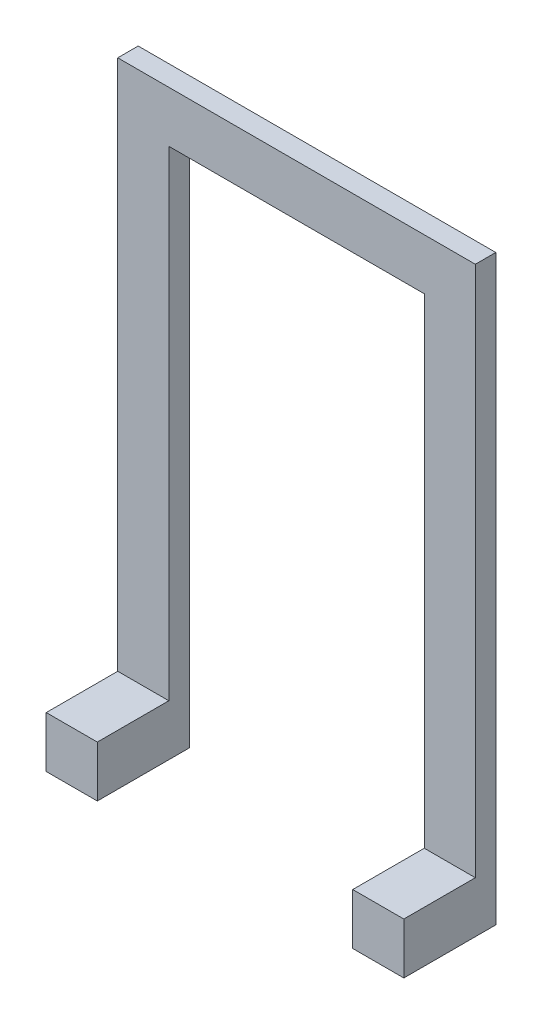
ISO-10303-21;
HEADER;
FILE_DESCRIPTION(('STEP AP214'),'2;1');
FILE_NAME('part.step','',(''),(''),'','','');
FILE_SCHEMA(('AUTOMOTIVE_DESIGN { 1 0 10303 214 1 1 1 1 }'));
ENDSEC;
DATA;
#1=APPLICATION_CONTEXT('core data for automotive mechanical design processes');
#2=APPLICATION_PROTOCOL_DEFINITION('international standard','automotive_design',2000,#1);
#3=PRODUCT_CONTEXT('',#1,'mechanical');
#4=PRODUCT('Part','Part','',(#3));
#5=PRODUCT_RELATED_PRODUCT_CATEGORY('part','',(#4));
#6=PRODUCT_DEFINITION_FORMATION('','',#4);
#7=PRODUCT_DEFINITION_CONTEXT('part definition',#1,'design');
#8=PRODUCT_DEFINITION('design','',#6,#7);
#9=PRODUCT_DEFINITION_SHAPE('','',#8);
#10=(LENGTH_UNIT() NAMED_UNIT(*) SI_UNIT(.MILLI.,.METRE.));
#11=(NAMED_UNIT(*) PLANE_ANGLE_UNIT() SI_UNIT($,.RADIAN.));
#12=(NAMED_UNIT(*) SI_UNIT($,.STERADIAN.) SOLID_ANGLE_UNIT());
#13=UNCERTAINTY_MEASURE_WITH_UNIT(LENGTH_MEASURE(1.E-05),#10,'distance_accuracy_value','');
#14=(GEOMETRIC_REPRESENTATION_CONTEXT(3) GLOBAL_UNCERTAINTY_ASSIGNED_CONTEXT((#13)) GLOBAL_UNIT_ASSIGNED_CONTEXT((#10,
#11,#12)) REPRESENTATION_CONTEXT('',''));
#15=CARTESIAN_POINT('',(0.,0.,0.));
#16=DIRECTION('',(0.,0.,1.));
#17=DIRECTION('',(1.,0.,0.));
#18=AXIS2_PLACEMENT_3D('',#15,#16,#17);
#19=CARTESIAN_POINT('',(0.,0.,1.));
#20=DIRECTION('',(0.,0.,1.));
#21=DIRECTION('',(1.,0.,0.));
#22=AXIS2_PLACEMENT_3D('',#19,#20,#21);
#23=PLANE('',#22);
#24=DIRECTION('',(0.,1.,0.));
#25=VECTOR('',#24,1.);
#26=CARTESIAN_POINT('',(6.25,0.,1.));
#27=LINE('',#26,#25);
#28=CARTESIAN_POINT('',(6.25,-14.75,1.));
#29=VERTEX_POINT('',#28);
#30=CARTESIAN_POINT('',(6.25,8.75,1.));
#31=VERTEX_POINT('',#30);
#32=EDGE_CURVE('E209',#29,#31,#27,.T.);
#33=ORIENTED_EDGE('',*,*,#32,.F.);
#34=DIRECTION('',(-1.,0.,0.));
#35=VECTOR('',#34,1.);
#36=CARTESIAN_POINT('',(6.25,-14.75,1.));
#37=LINE('',#36,#35);
#38=CARTESIAN_POINT('',(8.74999999999998,-14.75,1.));
#39=VERTEX_POINT('',#38);
#40=EDGE_CURVE('E161',#39,#29,#37,.T.);
#41=ORIENTED_EDGE('',*,*,#40,.F.);
#42=DIRECTION('',(0.,1.,0.));
#43=VECTOR('',#42,1.);
#44=CARTESIAN_POINT('',(8.74999999999999,0.,1.));
#45=LINE('',#44,#43);
#46=CARTESIAN_POINT('',(8.75,11.25,1.));
#47=VERTEX_POINT('',#46);
#48=EDGE_CURVE('E212',#39,#47,#45,.T.);
#49=ORIENTED_EDGE('',*,*,#48,.T.);
#50=DIRECTION('',(1.,0.,0.));
#51=VECTOR('',#50,1.);
#52=CARTESIAN_POINT('',(0.,11.25,1.));
#53=LINE('',#52,#51);
#54=CARTESIAN_POINT('',(-8.75,11.25,1.));
#55=VERTEX_POINT('',#54);
#56=EDGE_CURVE('E215',#55,#47,#53,.T.);
#57=ORIENTED_EDGE('',*,*,#56,.F.);
#58=DIRECTION('',(0.,1.,0.));
#59=VECTOR('',#58,1.);
#60=CARTESIAN_POINT('',(-8.75,0.,1.));
#61=LINE('',#60,#59);
#62=CARTESIAN_POINT('',(-8.75,-14.75,1.));
#63=VERTEX_POINT('',#62);
#64=EDGE_CURVE('E219',#63,#55,#61,.T.);
#65=ORIENTED_EDGE('',*,*,#64,.F.);
#66=DIRECTION('',(-1.,0.,0.));
#67=VECTOR('',#66,1.);
#68=CARTESIAN_POINT('',(-6.25,-14.75,1.));
#69=LINE('',#68,#67);
#70=CARTESIAN_POINT('',(-6.25,-14.75,1.));
#71=VERTEX_POINT('',#70);
#72=EDGE_CURVE('E67',#71,#63,#69,.T.);
#73=ORIENTED_EDGE('',*,*,#72,.F.);
#74=DIRECTION('',(0.,1.,0.));
#75=VECTOR('',#74,1.);
#76=CARTESIAN_POINT('',(-6.25,0.,1.));
#77=LINE('',#76,#75);
#78=CARTESIAN_POINT('',(-6.25,8.75,1.));
#79=VERTEX_POINT('',#78);
#80=EDGE_CURVE('E201',#71,#79,#77,.T.);
#81=ORIENTED_EDGE('',*,*,#80,.T.);
#82=DIRECTION('',(1.,0.,0.));
#83=VECTOR('',#82,1.);
#84=CARTESIAN_POINT('',(0.,8.75,1.));
#85=LINE('',#84,#83);
#86=EDGE_CURVE('E204',#79,#31,#85,.T.);
#87=ORIENTED_EDGE('',*,*,#86,.T.);
#88=EDGE_LOOP('',(#33,#41,#49,#57,#65,#73,#81,#87));
#89=FACE_BOUND('',#88,.T.);
#90=ADVANCED_FACE('F43',(#89),#23,.T.);
#91=CARTESIAN_POINT('',(0.,-17.25,1.));
#92=DIRECTION('',(0.,1.,0.));
#93=DIRECTION('',(0.,0.,1.));
#94=AXIS2_PLACEMENT_3D('',#91,#92,#93);
#95=PLANE('',#94);
#96=DIRECTION('',(1.,0.,0.));
#97=VECTOR('',#96,1.);
#98=CARTESIAN_POINT('',(0.,-17.25,0.));
#99=LINE('',#98,#97);
#100=CARTESIAN_POINT('',(-8.75,-17.25,0.));
#101=VERTEX_POINT('',#100);
#102=CARTESIAN_POINT('',(-6.25,-17.25,0.));
#103=VERTEX_POINT('',#102);
#104=EDGE_CURVE('E200',#101,#103,#99,.T.);
#105=ORIENTED_EDGE('',*,*,#104,.T.);
#106=DIRECTION('',(0.,0.,-1.));
#107=VECTOR('',#106,1.);
#108=CARTESIAN_POINT('',(-6.25,-17.25,1.));
#109=LINE('',#108,#107);
#110=CARTESIAN_POINT('',(-6.25,-17.25,4.5));
#111=VERTEX_POINT('',#110);
#112=EDGE_CURVE('E11',#111,#103,#109,.T.);
#113=ORIENTED_EDGE('',*,*,#112,.F.);
#114=DIRECTION('',(1.,0.,0.));
#115=VECTOR('',#114,1.);
#116=CARTESIAN_POINT('',(-6.25,-17.25,4.5));
#117=LINE('',#116,#115);
#118=CARTESIAN_POINT('',(-8.75,-17.25,4.5));
#119=VERTEX_POINT('',#118);
#120=EDGE_CURVE('E186',#119,#111,#117,.T.);
#121=ORIENTED_EDGE('',*,*,#120,.F.);
#122=DIRECTION('',(0.,0.,-1.));
#123=VECTOR('',#122,1.);
#124=CARTESIAN_POINT('',(-8.75,-17.25,1.));
#125=LINE('',#124,#123);
#126=EDGE_CURVE('E222',#119,#101,#125,.T.);
#127=ORIENTED_EDGE('',*,*,#126,.T.);
#128=EDGE_LOOP('',(#105,#113,#121,#127));
#129=FACE_BOUND('',#128,.T.);
#130=ADVANCED_FACE('F45',(#129),#95,.F.);
#131=CARTESIAN_POINT('',(-6.25,0.,1.));
#132=DIRECTION('',(-1.,0.,0.));
#133=DIRECTION('',(0.,0.,1.));
#134=AXIS2_PLACEMENT_3D('',#131,#132,#133);
#135=PLANE('',#134);
#136=DIRECTION('',(0.,1.,0.));
#137=VECTOR('',#136,1.);
#138=CARTESIAN_POINT('',(-6.25,0.,0.));
#139=LINE('',#138,#137);
#140=CARTESIAN_POINT('',(-6.25,8.75,0.));
#141=VERTEX_POINT('',#140);
#142=EDGE_CURVE('E226',#103,#141,#139,.T.);
#143=ORIENTED_EDGE('',*,*,#142,.T.);
#144=DIRECTION('',(0.,0.,-1.));
#145=VECTOR('',#144,1.);
#146=CARTESIAN_POINT('',(-6.25,8.75,1.));
#147=LINE('',#146,#145);
#148=EDGE_CURVE('E52',#79,#141,#147,.T.);
#149=ORIENTED_EDGE('',*,*,#148,.F.);
#150=ORIENTED_EDGE('',*,*,#80,.F.);
#151=DIRECTION('',(0.,0.,-1.));
#152=VECTOR('',#151,1.);
#153=CARTESIAN_POINT('',(-6.25,-14.75,4.5));
#154=LINE('',#153,#152);
#155=CARTESIAN_POINT('',(-6.25,-14.75,4.5));
#156=VERTEX_POINT('',#155);
#157=EDGE_CURVE('E196',#156,#71,#154,.T.);
#158=ORIENTED_EDGE('',*,*,#157,.F.);
#159=DIRECTION('',(0.,1.,0.));
#160=VECTOR('',#159,1.);
#161=CARTESIAN_POINT('',(-6.25,-17.25,4.5));
#162=LINE('',#161,#160);
#163=EDGE_CURVE('E175',#111,#156,#162,.T.);
#164=ORIENTED_EDGE('',*,*,#163,.F.);
#165=ORIENTED_EDGE('',*,*,#112,.T.);
#166=EDGE_LOOP('',(#143,#149,#150,#158,#164,#165));
#167=FACE_BOUND('',#166,.T.);
#168=ADVANCED_FACE('F280',(#167),#135,.F.);
#169=CARTESIAN_POINT('',(0.,8.75,1.));
#170=DIRECTION('',(0.,1.,0.));
#171=DIRECTION('',(0.,0.,1.));
#172=AXIS2_PLACEMENT_3D('',#169,#170,#171);
#173=PLANE('',#172);
#174=DIRECTION('',(1.,0.,0.));
#175=VECTOR('',#174,1.);
#176=CARTESIAN_POINT('',(0.,8.75,0.));
#177=LINE('',#176,#175);
#178=CARTESIAN_POINT('',(6.25,8.75,0.));
#179=VERTEX_POINT('',#178);
#180=EDGE_CURVE('E229',#141,#179,#177,.T.);
#181=ORIENTED_EDGE('',*,*,#180,.T.);
#182=DIRECTION('',(0.,0.,-1.));
#183=VECTOR('',#182,1.);
#184=CARTESIAN_POINT('',(6.25,8.75,1.));
#185=LINE('',#184,#183);
#186=EDGE_CURVE('E145',#31,#179,#185,.T.);
#187=ORIENTED_EDGE('',*,*,#186,.F.);
#188=ORIENTED_EDGE('',*,*,#86,.F.);
#189=ORIENTED_EDGE('',*,*,#148,.T.);
#190=EDGE_LOOP('',(#181,#187,#188,#189));
#191=FACE_BOUND('',#190,.T.);
#192=ADVANCED_FACE('F266',(#191),#173,.F.);
#193=CARTESIAN_POINT('',(6.25,0.,1.));
#194=DIRECTION('',(-1.,0.,0.));
#195=DIRECTION('',(0.,-1.,0.));
#196=AXIS2_PLACEMENT_3D('',#193,#194,#195);
#197=PLANE('',#196);
#198=DIRECTION('',(0.,1.,0.));
#199=VECTOR('',#198,1.);
#200=CARTESIAN_POINT('',(6.25,0.,0.));
#201=LINE('',#200,#199);
#202=CARTESIAN_POINT('',(6.25,-17.25,0.));
#203=VERTEX_POINT('',#202);
#204=EDGE_CURVE('E141',#203,#179,#201,.T.);
#205=ORIENTED_EDGE('',*,*,#204,.F.);
#206=DIRECTION('',(0.,0.,-1.));
#207=VECTOR('',#206,1.);
#208=CARTESIAN_POINT('',(6.25,-17.25,1.));
#209=LINE('',#208,#207);
#210=CARTESIAN_POINT('',(6.25,-17.25,4.5));
#211=VERTEX_POINT('',#210);
#212=EDGE_CURVE('E134',#211,#203,#209,.T.);
#213=ORIENTED_EDGE('',*,*,#212,.F.);
#214=DIRECTION('',(0.,-1.,0.));
#215=VECTOR('',#214,1.);
#216=CARTESIAN_POINT('',(6.25,-17.25,4.5));
#217=LINE('',#216,#215);
#218=CARTESIAN_POINT('',(6.25,-14.75,4.5));
#219=VERTEX_POINT('',#218);
#220=EDGE_CURVE('E139',#219,#211,#217,.T.);
#221=ORIENTED_EDGE('',*,*,#220,.F.);
#222=DIRECTION('',(0.,0.,-1.));
#223=VECTOR('',#222,1.);
#224=CARTESIAN_POINT('',(6.25,-14.75,4.5));
#225=LINE('',#224,#223);
#226=EDGE_CURVE('E169',#219,#29,#225,.T.);
#227=ORIENTED_EDGE('',*,*,#226,.T.);
#228=ORIENTED_EDGE('',*,*,#32,.T.);
#229=ORIENTED_EDGE('',*,*,#186,.T.);
#230=EDGE_LOOP('',(#205,#213,#221,#227,#228,#229));
#231=FACE_BOUND('',#230,.T.);
#232=ADVANCED_FACE('F136',(#231),#197,.T.);
#233=CARTESIAN_POINT('',(0.,-17.25,1.));
#234=DIRECTION('',(0.,1.,0.));
#235=DIRECTION('',(0.,0.,1.));
#236=AXIS2_PLACEMENT_3D('',#233,#234,#235);
#237=PLANE('',#236);
#238=DIRECTION('',(1.,0.,0.));
#239=VECTOR('',#238,1.);
#240=CARTESIAN_POINT('',(0.,-17.25,0.));
#241=LINE('',#240,#239);
#242=CARTESIAN_POINT('',(8.75,-17.25,0.));
#243=VERTEX_POINT('',#242);
#244=EDGE_CURVE('E235',#203,#243,#241,.T.);
#245=ORIENTED_EDGE('',*,*,#244,.T.);
#246=DIRECTION('',(0.,0.,-1.));
#247=VECTOR('',#246,1.);
#248=CARTESIAN_POINT('',(8.75,-17.25,1.));
#249=LINE('',#248,#247);
#250=CARTESIAN_POINT('',(8.75,-17.25,4.5));
#251=VERTEX_POINT('',#250);
#252=EDGE_CURVE('E146',#251,#243,#249,.T.);
#253=ORIENTED_EDGE('',*,*,#252,.F.);
#254=DIRECTION('',(1.,0.,0.));
#255=VECTOR('',#254,1.);
#256=CARTESIAN_POINT('',(6.25,-17.25,4.5));
#257=LINE('',#256,#255);
#258=EDGE_CURVE('E149',#211,#251,#257,.T.);
#259=ORIENTED_EDGE('',*,*,#258,.F.);
#260=ORIENTED_EDGE('',*,*,#212,.T.);
#261=EDGE_LOOP('',(#245,#253,#259,#260));
#262=FACE_BOUND('',#261,.T.);
#263=ADVANCED_FACE('F150',(#262),#237,.F.);
#264=CARTESIAN_POINT('',(8.74999999999999,0.,1.));
#265=DIRECTION('',(-1.,0.,0.));
#266=DIRECTION('',(0.,-1.,0.));
#267=AXIS2_PLACEMENT_3D('',#264,#265,#266);
#268=PLANE('',#267);
#269=DIRECTION('',(0.,1.,0.));
#270=VECTOR('',#269,1.);
#271=CARTESIAN_POINT('',(8.74999999999999,0.,0.));
#272=LINE('',#271,#270);
#273=CARTESIAN_POINT('',(8.75,11.25,0.));
#274=VERTEX_POINT('',#273);
#275=EDGE_CURVE('E238',#243,#274,#272,.T.);
#276=ORIENTED_EDGE('',*,*,#275,.T.);
#277=DIRECTION('',(0.,0.,-1.));
#278=VECTOR('',#277,1.);
#279=CARTESIAN_POINT('',(8.75,11.25,1.));
#280=LINE('',#279,#278);
#281=EDGE_CURVE('E254',#47,#274,#280,.T.);
#282=ORIENTED_EDGE('',*,*,#281,.F.);
#283=ORIENTED_EDGE('',*,*,#48,.F.);
#284=DIRECTION('',(0.,0.,-1.));
#285=VECTOR('',#284,1.);
#286=CARTESIAN_POINT('',(8.75,-14.75,4.5));
#287=LINE('',#286,#285);
#288=CARTESIAN_POINT('',(8.75,-14.75,4.5));
#289=VERTEX_POINT('',#288);
#290=EDGE_CURVE('E59',#289,#39,#287,.T.);
#291=ORIENTED_EDGE('',*,*,#290,.F.);
#292=DIRECTION('',(0.,1.,0.));
#293=VECTOR('',#292,1.);
#294=CARTESIAN_POINT('',(8.75,-17.25,4.5));
#295=LINE('',#294,#293);
#296=EDGE_CURVE('E155',#251,#289,#295,.T.);
#297=ORIENTED_EDGE('',*,*,#296,.F.);
#298=ORIENTED_EDGE('',*,*,#252,.T.);
#299=EDGE_LOOP('',(#276,#282,#283,#291,#297,#298));
#300=FACE_BOUND('',#299,.T.);
#301=ADVANCED_FACE('F274',(#300),#268,.F.);
#302=CARTESIAN_POINT('',(0.,11.25,1.));
#303=DIRECTION('',(0.,1.,0.));
#304=DIRECTION('',(0.,0.,1.));
#305=AXIS2_PLACEMENT_3D('',#302,#303,#304);
#306=PLANE('',#305);
#307=DIRECTION('',(1.,0.,0.));
#308=VECTOR('',#307,1.);
#309=CARTESIAN_POINT('',(0.,11.25,0.));
#310=LINE('',#309,#308);
#311=CARTESIAN_POINT('',(-8.75,11.25,0.));
#312=VERTEX_POINT('',#311);
#313=EDGE_CURVE('E242',#312,#274,#310,.T.);
#314=ORIENTED_EDGE('',*,*,#313,.F.);
#315=DIRECTION('',(0.,0.,-1.));
#316=VECTOR('',#315,1.);
#317=CARTESIAN_POINT('',(-8.75,11.25,1.));
#318=LINE('',#317,#316);
#319=EDGE_CURVE('E251',#55,#312,#318,.T.);
#320=ORIENTED_EDGE('',*,*,#319,.F.);
#321=ORIENTED_EDGE('',*,*,#56,.T.);
#322=ORIENTED_EDGE('',*,*,#281,.T.);
#323=EDGE_LOOP('',(#314,#320,#321,#322));
#324=FACE_BOUND('',#323,.T.);
#325=ADVANCED_FACE('F297',(#324),#306,.T.);
#326=CARTESIAN_POINT('',(-8.75,0.,1.));
#327=DIRECTION('',(-1.,0.,0.));
#328=DIRECTION('',(0.,-1.,0.));
#329=AXIS2_PLACEMENT_3D('',#326,#327,#328);
#330=PLANE('',#329);
#331=DIRECTION('',(0.,1.,0.));
#332=VECTOR('',#331,1.);
#333=CARTESIAN_POINT('',(-8.75,0.,0.));
#334=LINE('',#333,#332);
#335=EDGE_CURVE('E205',#101,#312,#334,.T.);
#336=ORIENTED_EDGE('',*,*,#335,.F.);
#337=ORIENTED_EDGE('',*,*,#126,.F.);
#338=DIRECTION('',(0.,-1.,0.));
#339=VECTOR('',#338,1.);
#340=CARTESIAN_POINT('',(-8.75,-17.25,4.5));
#341=LINE('',#340,#339);
#342=CARTESIAN_POINT('',(-8.75,-14.75,4.5));
#343=VERTEX_POINT('',#342);
#344=EDGE_CURVE('E182',#343,#119,#341,.T.);
#345=ORIENTED_EDGE('',*,*,#344,.F.);
#346=DIRECTION('',(0.,0.,-1.));
#347=VECTOR('',#346,1.);
#348=CARTESIAN_POINT('',(-8.75,-14.75,4.5));
#349=LINE('',#348,#347);
#350=EDGE_CURVE('E190',#343,#63,#349,.T.);
#351=ORIENTED_EDGE('',*,*,#350,.T.);
#352=ORIENTED_EDGE('',*,*,#64,.T.);
#353=ORIENTED_EDGE('',*,*,#319,.T.);
#354=EDGE_LOOP('',(#336,#337,#345,#351,#352,#353));
#355=FACE_BOUND('',#354,.T.);
#356=ADVANCED_FACE('F292',(#355),#330,.T.);
#357=CARTESIAN_POINT('',(0.,0.,0.));
#358=DIRECTION('',(0.,0.,1.));
#359=DIRECTION('',(1.,0.,0.));
#360=AXIS2_PLACEMENT_3D('',#357,#358,#359);
#361=PLANE('',#360);
#362=ORIENTED_EDGE('',*,*,#104,.F.);
#363=ORIENTED_EDGE('',*,*,#335,.T.);
#364=ORIENTED_EDGE('',*,*,#313,.T.);
#365=ORIENTED_EDGE('',*,*,#275,.F.);
#366=ORIENTED_EDGE('',*,*,#244,.F.);
#367=ORIENTED_EDGE('',*,*,#204,.T.);
#368=ORIENTED_EDGE('',*,*,#180,.F.);
#369=ORIENTED_EDGE('',*,*,#142,.F.);
#370=EDGE_LOOP('',(#362,#363,#364,#365,#366,#367,#368,#369));
#371=FACE_BOUND('',#370,.T.);
#372=ADVANCED_FACE('F271',(#371),#361,.F.);
#373=CARTESIAN_POINT('',(-6.25,-14.75,4.5));
#374=DIRECTION('',(0.,-1.,0.));
#375=DIRECTION('',(1.,0.,0.));
#376=AXIS2_PLACEMENT_3D('',#373,#374,#375);
#377=PLANE('',#376);
#378=ORIENTED_EDGE('',*,*,#72,.T.);
#379=ORIENTED_EDGE('',*,*,#350,.F.);
#380=DIRECTION('',(-1.,0.,0.));
#381=VECTOR('',#380,1.);
#382=CARTESIAN_POINT('',(-6.25,-14.75,4.5));
#383=LINE('',#382,#381);
#384=EDGE_CURVE('E179',#156,#343,#383,.T.);
#385=ORIENTED_EDGE('',*,*,#384,.F.);
#386=ORIENTED_EDGE('',*,*,#157,.T.);
#387=EDGE_LOOP('',(#378,#379,#385,#386));
#388=FACE_BOUND('',#387,.T.);
#389=ADVANCED_FACE('F283',(#388),#377,.F.);
#390=CARTESIAN_POINT('',(0.,0.,4.5));
#391=DIRECTION('',(0.,0.,1.));
#392=DIRECTION('',(1.,0.,0.));
#393=AXIS2_PLACEMENT_3D('',#390,#391,#392);
#394=PLANE('',#393);
#395=ORIENTED_EDGE('',*,*,#163,.T.);
#396=ORIENTED_EDGE('',*,*,#384,.T.);
#397=ORIENTED_EDGE('',*,*,#344,.T.);
#398=ORIENTED_EDGE('',*,*,#120,.T.);
#399=EDGE_LOOP('',(#395,#396,#397,#398));
#400=FACE_BOUND('',#399,.T.);
#401=ADVANCED_FACE('F287',(#400),#394,.T.);
#402=CARTESIAN_POINT('',(6.25,-14.75,4.5));
#403=DIRECTION('',(0.,-1.,0.));
#404=DIRECTION('',(0.,0.,-1.));
#405=AXIS2_PLACEMENT_3D('',#402,#403,#404);
#406=PLANE('',#405);
#407=ORIENTED_EDGE('',*,*,#40,.T.);
#408=ORIENTED_EDGE('',*,*,#226,.F.);
#409=DIRECTION('',(-1.,0.,0.));
#410=VECTOR('',#409,1.);
#411=CARTESIAN_POINT('',(6.25,-14.75,4.5));
#412=LINE('',#411,#410);
#413=EDGE_CURVE('E158',#289,#219,#412,.T.);
#414=ORIENTED_EDGE('',*,*,#413,.F.);
#415=ORIENTED_EDGE('',*,*,#290,.T.);
#416=EDGE_LOOP('',(#407,#408,#414,#415));
#417=FACE_BOUND('',#416,.T.);
#418=ADVANCED_FACE('F277',(#417),#406,.F.);
#419=CARTESIAN_POINT('',(0.,0.,4.5));
#420=DIRECTION('',(0.,0.,-1.));
#421=DIRECTION('',(-1.,0.,0.));
#422=AXIS2_PLACEMENT_3D('',#419,#420,#421);
#423=PLANE('',#422);
#424=ORIENTED_EDGE('',*,*,#220,.T.);
#425=ORIENTED_EDGE('',*,*,#258,.T.);
#426=ORIENTED_EDGE('',*,*,#296,.T.);
#427=ORIENTED_EDGE('',*,*,#413,.T.);
#428=EDGE_LOOP('',(#424,#425,#426,#427));
#429=FACE_BOUND('',#428,.T.);
#430=ADVANCED_FACE('F157',(#429),#423,.F.);
#431=CLOSED_SHELL('',(#90,#130,#168,#192,#232,#263,#301,#325,#356,#372,#389,#401,#418,#430));
#432=MANIFOLD_SOLID_BREP('B2',#431);
#433=ADVANCED_BREP_SHAPE_REPRESENTATION('',(#18,#432),#14);
#434=SHAPE_DEFINITION_REPRESENTATION(#9,#433);
ENDSEC;
END-ISO-10303-21;
